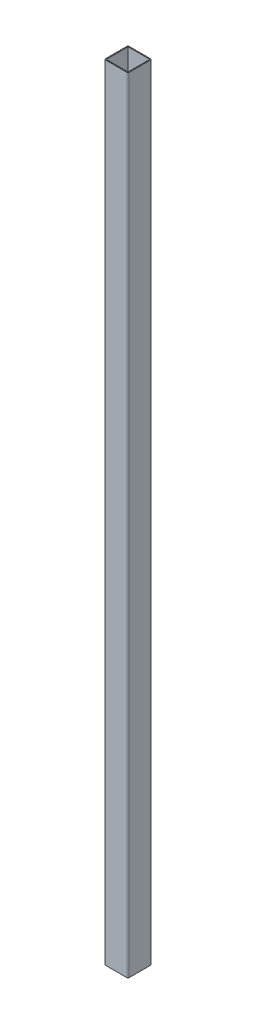
ISO-10303-21;
HEADER;
FILE_DESCRIPTION(('STEP AP214'),'2;1');
FILE_NAME('part.step','',(''),(''),'','','');
FILE_SCHEMA(('AUTOMOTIVE_DESIGN { 1 0 10303 214 1 1 1 1 }'));
ENDSEC;
DATA;
#1=APPLICATION_CONTEXT('core data for automotive mechanical design processes');
#2=APPLICATION_PROTOCOL_DEFINITION('international standard','automotive_design',2000,#1);
#3=PRODUCT_CONTEXT('',#1,'mechanical');
#4=PRODUCT('Part','Part','',(#3));
#5=PRODUCT_RELATED_PRODUCT_CATEGORY('part','',(#4));
#6=PRODUCT_DEFINITION_FORMATION('','',#4);
#7=PRODUCT_DEFINITION_CONTEXT('part definition',#1,'design');
#8=PRODUCT_DEFINITION('design','',#6,#7);
#9=PRODUCT_DEFINITION_SHAPE('','',#8);
#10=(LENGTH_UNIT() NAMED_UNIT(*) SI_UNIT(.MILLI.,.METRE.));
#11=(NAMED_UNIT(*) PLANE_ANGLE_UNIT() SI_UNIT($,.RADIAN.));
#12=(NAMED_UNIT(*) SI_UNIT($,.STERADIAN.) SOLID_ANGLE_UNIT());
#13=UNCERTAINTY_MEASURE_WITH_UNIT(LENGTH_MEASURE(1.E-05),#10,'distance_accuracy_value','');
#14=(GEOMETRIC_REPRESENTATION_CONTEXT(3) GLOBAL_UNCERTAINTY_ASSIGNED_CONTEXT((#13)) GLOBAL_UNIT_ASSIGNED_CONTEXT((#10,
#11,#12)) REPRESENTATION_CONTEXT('',''));
#15=CARTESIAN_POINT('',(0.,0.,0.));
#16=DIRECTION('',(0.,0.,1.));
#17=DIRECTION('',(1.,0.,0.));
#18=AXIS2_PLACEMENT_3D('',#15,#16,#17);
#19=CARTESIAN_POINT('',(73.9990000000007,-5307.,73.999));
#20=DIRECTION('',(0.,1.,0.));
#21=DIRECTION('',(-1.,0.,0.));
#22=AXIS2_PLACEMENT_3D('',#19,#20,#21);
#23=CYLINDRICAL_SURFACE('',#22,6.00100000000001);
#24=CARTESIAN_POINT('',(73.999,0.,73.999));
#25=DIRECTION('',(0.,-1.,0.));
#26=DIRECTION('',(1.,0.,0.));
#27=AXIS2_PLACEMENT_3D('',#24,#25,#26);
#28=CIRCLE('',#27,6.00100000000001);
#29=CARTESIAN_POINT('',(80.,0.,73.999));
#30=VERTEX_POINT('',#29);
#31=CARTESIAN_POINT('',(73.999,0.,80.));
#32=VERTEX_POINT('',#31);
#33=EDGE_CURVE('E232',#30,#32,#28,.T.);
#34=ORIENTED_EDGE('',*,*,#33,.T.);
#35=DIRECTION('',(0.,1.,0.));
#36=VECTOR('',#35,1.);
#37=CARTESIAN_POINT('',(73.9990000000007,-5307.,80.));
#38=LINE('',#37,#36);
#39=CARTESIAN_POINT('',(73.9990000000007,-5307.,80.));
#40=VERTEX_POINT('',#39);
#41=EDGE_CURVE('E12',#40,#32,#38,.T.);
#42=ORIENTED_EDGE('',*,*,#41,.F.);
#43=CARTESIAN_POINT('',(73.9990000000007,-5307.,73.999));
#44=DIRECTION('',(0.,-1.,0.));
#45=DIRECTION('',(1.,0.,0.));
#46=AXIS2_PLACEMENT_3D('',#43,#44,#45);
#47=CIRCLE('',#46,6.00100000000001);
#48=CARTESIAN_POINT('',(80.0000000000006,-5307.,73.999));
#49=VERTEX_POINT('',#48);
#50=EDGE_CURVE('E310',#49,#40,#47,.T.);
#51=ORIENTED_EDGE('',*,*,#50,.F.);
#52=DIRECTION('',(0.,1.,0.));
#53=VECTOR('',#52,1.);
#54=CARTESIAN_POINT('',(80.0000000000006,-5307.,73.999));
#55=LINE('',#54,#53);
#56=EDGE_CURVE('E247',#49,#30,#55,.T.);
#57=ORIENTED_EDGE('',*,*,#56,.T.);
#58=EDGE_LOOP('',(#34,#42,#51,#57));
#59=FACE_BOUND('',#58,.T.);
#60=ADVANCED_FACE('F60',(#59),#23,.T.);
#61=CARTESIAN_POINT('',(73.9990000000007,-5307.,80.));
#62=DIRECTION('',(0.,0.,-1.));
#63=DIRECTION('',(-1.,0.,0.));
#64=AXIS2_PLACEMENT_3D('',#61,#62,#63);
#65=PLANE('',#64);
#66=DIRECTION('',(-1.,0.,0.));
#67=VECTOR('',#66,1.);
#68=CARTESIAN_POINT('',(73.999,0.,80.));
#69=LINE('',#68,#67);
#70=CARTESIAN_POINT('',(-73.999,0.,80.));
#71=VERTEX_POINT('',#70);
#72=EDGE_CURVE('E235',#32,#71,#69,.T.);
#73=ORIENTED_EDGE('',*,*,#72,.T.);
#74=DIRECTION('',(0.,1.,0.));
#75=VECTOR('',#74,1.);
#76=CARTESIAN_POINT('',(-73.9989999999994,-5307.,80.));
#77=LINE('',#76,#75);
#78=CARTESIAN_POINT('',(-73.9989999999994,-5307.,80.));
#79=VERTEX_POINT('',#78);
#80=EDGE_CURVE('E70',#79,#71,#77,.T.);
#81=ORIENTED_EDGE('',*,*,#80,.F.);
#82=DIRECTION('',(-1.,0.,0.));
#83=VECTOR('',#82,1.);
#84=CARTESIAN_POINT('',(73.9990000000007,-5307.,80.));
#85=LINE('',#84,#83);
#86=EDGE_CURVE('E312',#40,#79,#85,.T.);
#87=ORIENTED_EDGE('',*,*,#86,.F.);
#88=ORIENTED_EDGE('',*,*,#41,.T.);
#89=EDGE_LOOP('',(#73,#81,#87,#88));
#90=FACE_BOUND('',#89,.T.);
#91=ADVANCED_FACE('F347',(#90),#65,.F.);
#92=CARTESIAN_POINT('',(-73.9989999999994,-5307.,73.999));
#93=DIRECTION('',(0.,1.,0.));
#94=DIRECTION('',(-1.,0.,0.));
#95=AXIS2_PLACEMENT_3D('',#92,#93,#94);
#96=CYLINDRICAL_SURFACE('',#95,6.00100000000001);
#97=CARTESIAN_POINT('',(-73.999,0.,73.999));
#98=DIRECTION('',(0.,-1.,0.));
#99=DIRECTION('',(1.,0.,0.));
#100=AXIS2_PLACEMENT_3D('',#97,#98,#99);
#101=CIRCLE('',#100,6.00100000000001);
#102=CARTESIAN_POINT('',(-80.,0.,73.999));
#103=VERTEX_POINT('',#102);
#104=EDGE_CURVE('E237',#71,#103,#101,.T.);
#105=ORIENTED_EDGE('',*,*,#104,.T.);
#106=DIRECTION('',(0.,1.,0.));
#107=VECTOR('',#106,1.);
#108=CARTESIAN_POINT('',(-79.9999999999993,-5307.,73.999));
#109=LINE('',#108,#107);
#110=CARTESIAN_POINT('',(-79.9999999999993,-5307.,73.999));
#111=VERTEX_POINT('',#110);
#112=EDGE_CURVE('E254',#111,#103,#109,.T.);
#113=ORIENTED_EDGE('',*,*,#112,.F.);
#114=CARTESIAN_POINT('',(-73.9989999999994,-5307.,73.999));
#115=DIRECTION('',(0.,-1.,0.));
#116=DIRECTION('',(1.,0.,0.));
#117=AXIS2_PLACEMENT_3D('',#114,#115,#116);
#118=CIRCLE('',#117,6.00100000000001);
#119=EDGE_CURVE('E314',#79,#111,#118,.T.);
#120=ORIENTED_EDGE('',*,*,#119,.F.);
#121=ORIENTED_EDGE('',*,*,#80,.T.);
#122=EDGE_LOOP('',(#105,#113,#120,#121));
#123=FACE_BOUND('',#122,.T.);
#124=ADVANCED_FACE('F352',(#123),#96,.T.);
#125=CARTESIAN_POINT('',(-79.9999999999993,-5307.,-73.999));
#126=DIRECTION('',(1.,0.,0.));
#127=DIRECTION('',(0.,1.,0.));
#128=AXIS2_PLACEMENT_3D('',#125,#126,#127);
#129=PLANE('',#128);
#130=DIRECTION('',(0.,0.,-1.));
#131=VECTOR('',#130,1.);
#132=CARTESIAN_POINT('',(-80.,0.,-73.999));
#133=LINE('',#132,#131);
#134=CARTESIAN_POINT('',(-80.,0.,-73.999));
#135=VERTEX_POINT('',#134);
#136=EDGE_CURVE('E239',#103,#135,#133,.T.);
#137=ORIENTED_EDGE('',*,*,#136,.T.);
#138=DIRECTION('',(0.,1.,0.));
#139=VECTOR('',#138,1.);
#140=CARTESIAN_POINT('',(-79.9999999999993,-5307.,-73.999));
#141=LINE('',#140,#139);
#142=CARTESIAN_POINT('',(-79.9999999999993,-5307.,-73.999));
#143=VERTEX_POINT('',#142);
#144=EDGE_CURVE('E251',#143,#135,#141,.T.);
#145=ORIENTED_EDGE('',*,*,#144,.F.);
#146=DIRECTION('',(0.,0.,-1.));
#147=VECTOR('',#146,1.);
#148=CARTESIAN_POINT('',(-79.9999999999993,-5307.,-73.999));
#149=LINE('',#148,#147);
#150=EDGE_CURVE('E316',#111,#143,#149,.T.);
#151=ORIENTED_EDGE('',*,*,#150,.F.);
#152=ORIENTED_EDGE('',*,*,#112,.T.);
#153=EDGE_LOOP('',(#137,#145,#151,#152));
#154=FACE_BOUND('',#153,.T.);
#155=ADVANCED_FACE('F322',(#154),#129,.F.);
#156=CARTESIAN_POINT('',(-73.9989999999993,-5307.,-73.999));
#157=DIRECTION('',(0.,1.,0.));
#158=DIRECTION('',(-1.,0.,0.));
#159=AXIS2_PLACEMENT_3D('',#156,#157,#158);
#160=CYLINDRICAL_SURFACE('',#159,6.001);
#161=CARTESIAN_POINT('',(-73.999,0.,-73.999));
#162=DIRECTION('',(0.,-1.,0.));
#163=DIRECTION('',(1.,0.,0.));
#164=AXIS2_PLACEMENT_3D('',#161,#162,#163);
#165=CIRCLE('',#164,6.001);
#166=CARTESIAN_POINT('',(-73.999,0.,-80.));
#167=VERTEX_POINT('',#166);
#168=EDGE_CURVE('E241',#135,#167,#165,.T.);
#169=ORIENTED_EDGE('',*,*,#168,.T.);
#170=DIRECTION('',(0.,1.,0.));
#171=VECTOR('',#170,1.);
#172=CARTESIAN_POINT('',(-73.9989999999994,-5307.,-80.));
#173=LINE('',#172,#171);
#174=CARTESIAN_POINT('',(-73.9989999999994,-5307.,-80.));
#175=VERTEX_POINT('',#174);
#176=EDGE_CURVE('E199',#175,#167,#173,.T.);
#177=ORIENTED_EDGE('',*,*,#176,.F.);
#178=CARTESIAN_POINT('',(-73.9989999999993,-5307.,-73.999));
#179=DIRECTION('',(0.,-1.,0.));
#180=DIRECTION('',(1.,0.,0.));
#181=AXIS2_PLACEMENT_3D('',#178,#179,#180);
#182=CIRCLE('',#181,6.001);
#183=EDGE_CURVE('E190',#143,#175,#182,.T.);
#184=ORIENTED_EDGE('',*,*,#183,.F.);
#185=ORIENTED_EDGE('',*,*,#144,.T.);
#186=EDGE_LOOP('',(#169,#177,#184,#185));
#187=FACE_BOUND('',#186,.T.);
#188=ADVANCED_FACE('F326',(#187),#160,.T.);
#189=CARTESIAN_POINT('',(-73.9989999999994,-5307.,-80.));
#190=DIRECTION('',(0.,0.,1.));
#191=DIRECTION('',(1.,0.,0.));
#192=AXIS2_PLACEMENT_3D('',#189,#190,#191);
#193=PLANE('',#192);
#194=DIRECTION('',(1.,0.,0.));
#195=VECTOR('',#194,1.);
#196=CARTESIAN_POINT('',(-73.999,0.,-80.));
#197=LINE('',#196,#195);
#198=CARTESIAN_POINT('',(73.999,0.,-80.));
#199=VERTEX_POINT('',#198);
#200=EDGE_CURVE('E198',#167,#199,#197,.T.);
#201=ORIENTED_EDGE('',*,*,#200,.T.);
#202=DIRECTION('',(0.,1.,0.));
#203=VECTOR('',#202,1.);
#204=CARTESIAN_POINT('',(73.9990000000007,-5307.,-80.));
#205=LINE('',#204,#203);
#206=CARTESIAN_POINT('',(73.9990000000007,-5307.,-80.));
#207=VERTEX_POINT('',#206);
#208=EDGE_CURVE('E195',#207,#199,#205,.T.);
#209=ORIENTED_EDGE('',*,*,#208,.F.);
#210=DIRECTION('',(1.,0.,0.));
#211=VECTOR('',#210,1.);
#212=CARTESIAN_POINT('',(-73.9989999999994,-5307.,-80.));
#213=LINE('',#212,#211);
#214=EDGE_CURVE('E184',#175,#207,#213,.T.);
#215=ORIENTED_EDGE('',*,*,#214,.F.);
#216=ORIENTED_EDGE('',*,*,#176,.T.);
#217=EDGE_LOOP('',(#201,#209,#215,#216));
#218=FACE_BOUND('',#217,.T.);
#219=ADVANCED_FACE('F196',(#218),#193,.F.);
#220=CARTESIAN_POINT('',(73.9990000000006,-5307.,-73.999));
#221=DIRECTION('',(0.,1.,0.));
#222=DIRECTION('',(-1.,0.,0.));
#223=AXIS2_PLACEMENT_3D('',#220,#221,#222);
#224=CYLINDRICAL_SURFACE('',#223,6.001);
#225=CARTESIAN_POINT('',(73.999,0.,-73.999));
#226=DIRECTION('',(0.,-1.,0.));
#227=DIRECTION('',(1.,0.,0.));
#228=AXIS2_PLACEMENT_3D('',#225,#226,#227);
#229=CIRCLE('',#228,6.001);
#230=CARTESIAN_POINT('',(80.,0.,-73.999));
#231=VERTEX_POINT('',#230);
#232=EDGE_CURVE('E132',#199,#231,#229,.T.);
#233=ORIENTED_EDGE('',*,*,#232,.T.);
#234=DIRECTION('',(0.,1.,0.));
#235=VECTOR('',#234,1.);
#236=CARTESIAN_POINT('',(80.0000000000006,-5307.,-73.999));
#237=LINE('',#236,#235);
#238=CARTESIAN_POINT('',(80.0000000000006,-5307.,-73.999));
#239=VERTEX_POINT('',#238);
#240=EDGE_CURVE('E200',#239,#231,#237,.T.);
#241=ORIENTED_EDGE('',*,*,#240,.F.);
#242=CARTESIAN_POINT('',(73.9990000000006,-5307.,-73.999));
#243=DIRECTION('',(0.,-1.,0.));
#244=DIRECTION('',(1.,0.,0.));
#245=AXIS2_PLACEMENT_3D('',#242,#243,#244);
#246=CIRCLE('',#245,6.001);
#247=EDGE_CURVE('E188',#207,#239,#246,.T.);
#248=ORIENTED_EDGE('',*,*,#247,.F.);
#249=ORIENTED_EDGE('',*,*,#208,.T.);
#250=EDGE_LOOP('',(#233,#241,#248,#249));
#251=FACE_BOUND('',#250,.T.);
#252=ADVANCED_FACE('F202',(#251),#224,.T.);
#253=CARTESIAN_POINT('',(-73.9989999999994,-5307.,73.999));
#254=DIRECTION('',(0.,1.,0.));
#255=DIRECTION('',(-1.,0.,0.));
#256=AXIS2_PLACEMENT_3D('',#253,#254,#255);
#257=CYLINDRICAL_SURFACE('',#256,0.000999999999987122);
#258=CARTESIAN_POINT('',(-73.999,0.,73.999));
#259=DIRECTION('',(0.,-1.,0.));
#260=DIRECTION('',(1.,0.,0.));
#261=AXIS2_PLACEMENT_3D('',#258,#259,#260);
#262=CIRCLE('',#261,0.000999999999987122);
#263=CARTESIAN_POINT('',(-73.999,0.,74.));
#264=VERTEX_POINT('',#263);
#265=CARTESIAN_POINT('',(-74.,0.,73.999));
#266=VERTEX_POINT('',#265);
#267=EDGE_CURVE('E208',#264,#266,#262,.T.);
#268=ORIENTED_EDGE('',*,*,#267,.F.);
#269=DIRECTION('',(0.,1.,0.));
#270=VECTOR('',#269,1.);
#271=CARTESIAN_POINT('',(-73.9989999999993,-5307.,74.));
#272=LINE('',#271,#270);
#273=CARTESIAN_POINT('',(-73.9989999999993,-5307.,74.));
#274=VERTEX_POINT('',#273);
#275=EDGE_CURVE('E64',#274,#264,#272,.T.);
#276=ORIENTED_EDGE('',*,*,#275,.F.);
#277=CARTESIAN_POINT('',(-73.9989999999994,-5307.,73.999));
#278=DIRECTION('',(0.,-1.,0.));
#279=DIRECTION('',(1.,0.,0.));
#280=AXIS2_PLACEMENT_3D('',#277,#278,#279);
#281=CIRCLE('',#280,0.000999999999987122);
#282=CARTESIAN_POINT('',(-73.9999999999993,-5307.,73.999));
#283=VERTEX_POINT('',#282);
#284=EDGE_CURVE('E246',#274,#283,#281,.T.);
#285=ORIENTED_EDGE('',*,*,#284,.T.);
#286=DIRECTION('',(0.,1.,0.));
#287=VECTOR('',#286,1.);
#288=CARTESIAN_POINT('',(-73.9999999999993,-5307.,73.999));
#289=LINE('',#288,#287);
#290=EDGE_CURVE('E204',#283,#266,#289,.T.);
#291=ORIENTED_EDGE('',*,*,#290,.T.);
#292=EDGE_LOOP('',(#268,#276,#285,#291));
#293=FACE_BOUND('',#292,.T.);
#294=ADVANCED_FACE('F62',(#293),#257,.F.);
#295=CARTESIAN_POINT('',(73.9990000000006,-5307.,74.));
#296=DIRECTION('',(0.,0.,-1.));
#297=DIRECTION('',(-1.,0.,0.));
#298=AXIS2_PLACEMENT_3D('',#295,#296,#297);
#299=PLANE('',#298);
#300=DIRECTION('',(-1.,0.,0.));
#301=VECTOR('',#300,1.);
#302=CARTESIAN_POINT('',(73.999,0.,74.));
#303=LINE('',#302,#301);
#304=CARTESIAN_POINT('',(73.999,0.,74.));
#305=VERTEX_POINT('',#304);
#306=EDGE_CURVE('E211',#305,#264,#303,.T.);
#307=ORIENTED_EDGE('',*,*,#306,.F.);
#308=DIRECTION('',(0.,1.,0.));
#309=VECTOR('',#308,1.);
#310=CARTESIAN_POINT('',(73.9990000000006,-5307.,74.));
#311=LINE('',#310,#309);
#312=CARTESIAN_POINT('',(73.9990000000006,-5307.,74.));
#313=VERTEX_POINT('',#312);
#314=EDGE_CURVE('E269',#313,#305,#311,.T.);
#315=ORIENTED_EDGE('',*,*,#314,.F.);
#316=DIRECTION('',(-1.,0.,0.));
#317=VECTOR('',#316,1.);
#318=CARTESIAN_POINT('',(73.9990000000006,-5307.,74.));
#319=LINE('',#318,#317);
#320=EDGE_CURVE('E278',#313,#274,#319,.T.);
#321=ORIENTED_EDGE('',*,*,#320,.T.);
#322=ORIENTED_EDGE('',*,*,#275,.T.);
#323=EDGE_LOOP('',(#307,#315,#321,#322));
#324=FACE_BOUND('',#323,.T.);
#325=ADVANCED_FACE('F276',(#324),#299,.T.);
#326=CARTESIAN_POINT('',(73.9990000000007,-5307.,73.999));
#327=DIRECTION('',(0.,1.,0.));
#328=DIRECTION('',(-1.,0.,0.));
#329=AXIS2_PLACEMENT_3D('',#326,#327,#328);
#330=CYLINDRICAL_SURFACE('',#329,0.000999999999987122);
#331=CARTESIAN_POINT('',(73.999,0.,73.999));
#332=DIRECTION('',(0.,-1.,0.));
#333=DIRECTION('',(1.,0.,0.));
#334=AXIS2_PLACEMENT_3D('',#331,#332,#333);
#335=CIRCLE('',#334,0.000999999999987122);
#336=CARTESIAN_POINT('',(74.,0.,73.999));
#337=VERTEX_POINT('',#336);
#338=EDGE_CURVE('E214',#337,#305,#335,.T.);
#339=ORIENTED_EDGE('',*,*,#338,.F.);
#340=DIRECTION('',(0.,1.,0.));
#341=VECTOR('',#340,1.);
#342=CARTESIAN_POINT('',(74.0000000000007,-5307.,73.999));
#343=LINE('',#342,#341);
#344=CARTESIAN_POINT('',(74.0000000000007,-5307.,73.999));
#345=VERTEX_POINT('',#344);
#346=EDGE_CURVE('E268',#345,#337,#343,.T.);
#347=ORIENTED_EDGE('',*,*,#346,.F.);
#348=CARTESIAN_POINT('',(73.9990000000007,-5307.,73.999));
#349=DIRECTION('',(0.,-1.,0.));
#350=DIRECTION('',(1.,0.,0.));
#351=AXIS2_PLACEMENT_3D('',#348,#349,#350);
#352=CIRCLE('',#351,0.000999999999987122);
#353=EDGE_CURVE('E286',#345,#313,#352,.T.);
#354=ORIENTED_EDGE('',*,*,#353,.T.);
#355=ORIENTED_EDGE('',*,*,#314,.T.);
#356=EDGE_LOOP('',(#339,#347,#354,#355));
#357=FACE_BOUND('',#356,.T.);
#358=ADVANCED_FACE('F284',(#357),#330,.F.);
#359=CARTESIAN_POINT('',(74.0000000000006,-5307.,73.999));
#360=DIRECTION('',(-1.,0.,0.));
#361=DIRECTION('',(0.,-1.,0.));
#362=AXIS2_PLACEMENT_3D('',#359,#360,#361);
#363=PLANE('',#362);
#364=DIRECTION('',(0.,0.,1.));
#365=VECTOR('',#364,1.);
#366=CARTESIAN_POINT('',(74.,0.,73.999));
#367=LINE('',#366,#365);
#368=CARTESIAN_POINT('',(74.,0.,-73.999));
#369=VERTEX_POINT('',#368);
#370=EDGE_CURVE('E217',#369,#337,#367,.T.);
#371=ORIENTED_EDGE('',*,*,#370,.F.);
#372=DIRECTION('',(0.,1.,0.));
#373=VECTOR('',#372,1.);
#374=CARTESIAN_POINT('',(74.0000000000006,-5307.,-73.999));
#375=LINE('',#374,#373);
#376=CARTESIAN_POINT('',(74.0000000000006,-5307.,-73.999));
#377=VERTEX_POINT('',#376);
#378=EDGE_CURVE('E266',#377,#369,#375,.T.);
#379=ORIENTED_EDGE('',*,*,#378,.F.);
#380=DIRECTION('',(0.,0.,1.));
#381=VECTOR('',#380,1.);
#382=CARTESIAN_POINT('',(74.0000000000006,-5307.,73.999));
#383=LINE('',#382,#381);
#384=EDGE_CURVE('E292',#377,#345,#383,.T.);
#385=ORIENTED_EDGE('',*,*,#384,.T.);
#386=ORIENTED_EDGE('',*,*,#346,.T.);
#387=EDGE_LOOP('',(#371,#379,#385,#386));
#388=FACE_BOUND('',#387,.T.);
#389=ADVANCED_FACE('F295',(#388),#363,.T.);
#390=CARTESIAN_POINT('',(73.9990000000006,-5307.,-73.999));
#391=DIRECTION('',(0.,1.,0.));
#392=DIRECTION('',(-1.,0.,0.));
#393=AXIS2_PLACEMENT_3D('',#390,#391,#392);
#394=CYLINDRICAL_SURFACE('',#393,0.000999999999980183);
#395=CARTESIAN_POINT('',(73.999,0.,-73.999));
#396=DIRECTION('',(0.,-1.,0.));
#397=DIRECTION('',(1.,0.,0.));
#398=AXIS2_PLACEMENT_3D('',#395,#396,#397);
#399=CIRCLE('',#398,0.000999999999980183);
#400=CARTESIAN_POINT('',(73.999,0.,-74.));
#401=VERTEX_POINT('',#400);
#402=EDGE_CURVE('E220',#401,#369,#399,.T.);
#403=ORIENTED_EDGE('',*,*,#402,.F.);
#404=DIRECTION('',(0.,1.,0.));
#405=VECTOR('',#404,1.);
#406=CARTESIAN_POINT('',(73.9990000000006,-5307.,-74.));
#407=LINE('',#406,#405);
#408=CARTESIAN_POINT('',(73.9990000000006,-5307.,-74.));
#409=VERTEX_POINT('',#408);
#410=EDGE_CURVE('E264',#409,#401,#407,.T.);
#411=ORIENTED_EDGE('',*,*,#410,.F.);
#412=CARTESIAN_POINT('',(73.9990000000006,-5307.,-73.999));
#413=DIRECTION('',(0.,-1.,0.));
#414=DIRECTION('',(1.,0.,0.));
#415=AXIS2_PLACEMENT_3D('',#412,#413,#414);
#416=CIRCLE('',#415,0.000999999999980183);
#417=EDGE_CURVE('E296',#409,#377,#416,.T.);
#418=ORIENTED_EDGE('',*,*,#417,.T.);
#419=ORIENTED_EDGE('',*,*,#378,.T.);
#420=EDGE_LOOP('',(#403,#411,#418,#419));
#421=FACE_BOUND('',#420,.T.);
#422=ADVANCED_FACE('F363',(#421),#394,.F.);
#423=CARTESIAN_POINT('',(-73.9989999999993,-5307.,-74.));
#424=DIRECTION('',(0.,0.,1.));
#425=DIRECTION('',(1.,0.,0.));
#426=AXIS2_PLACEMENT_3D('',#423,#424,#425);
#427=PLANE('',#426);
#428=DIRECTION('',(1.,0.,0.));
#429=VECTOR('',#428,1.);
#430=CARTESIAN_POINT('',(-73.999,0.,-74.));
#431=LINE('',#430,#429);
#432=CARTESIAN_POINT('',(-73.999,0.,-74.));
#433=VERTEX_POINT('',#432);
#434=EDGE_CURVE('E223',#433,#401,#431,.T.);
#435=ORIENTED_EDGE('',*,*,#434,.F.);
#436=DIRECTION('',(0.,1.,0.));
#437=VECTOR('',#436,1.);
#438=CARTESIAN_POINT('',(-73.9989999999993,-5307.,-74.));
#439=LINE('',#438,#437);
#440=CARTESIAN_POINT('',(-73.9989999999993,-5307.,-74.));
#441=VERTEX_POINT('',#440);
#442=EDGE_CURVE('E262',#441,#433,#439,.T.);
#443=ORIENTED_EDGE('',*,*,#442,.F.);
#444=DIRECTION('',(1.,0.,0.));
#445=VECTOR('',#444,1.);
#446=CARTESIAN_POINT('',(-73.9989999999993,-5307.,-74.));
#447=LINE('',#446,#445);
#448=EDGE_CURVE('E298',#441,#409,#447,.T.);
#449=ORIENTED_EDGE('',*,*,#448,.T.);
#450=ORIENTED_EDGE('',*,*,#410,.T.);
#451=EDGE_LOOP('',(#435,#443,#449,#450));
#452=FACE_BOUND('',#451,.T.);
#453=ADVANCED_FACE('F359',(#452),#427,.T.);
#454=CARTESIAN_POINT('',(-73.9989999999993,-5307.,-73.999));
#455=DIRECTION('',(0.,1.,0.));
#456=DIRECTION('',(-1.,0.,0.));
#457=AXIS2_PLACEMENT_3D('',#454,#455,#456);
#458=CYLINDRICAL_SURFACE('',#457,0.000999999999980183);
#459=CARTESIAN_POINT('',(-73.999,0.,-73.999));
#460=DIRECTION('',(0.,-1.,0.));
#461=DIRECTION('',(1.,0.,0.));
#462=AXIS2_PLACEMENT_3D('',#459,#460,#461);
#463=CIRCLE('',#462,0.000999999999980183);
#464=CARTESIAN_POINT('',(-74.,0.,-73.999));
#465=VERTEX_POINT('',#464);
#466=EDGE_CURVE('E226',#465,#433,#463,.T.);
#467=ORIENTED_EDGE('',*,*,#466,.F.);
#468=DIRECTION('',(0.,1.,0.));
#469=VECTOR('',#468,1.);
#470=CARTESIAN_POINT('',(-73.9999999999993,-5307.,-73.999));
#471=LINE('',#470,#469);
#472=CARTESIAN_POINT('',(-73.9999999999993,-5307.,-73.999));
#473=VERTEX_POINT('',#472);
#474=EDGE_CURVE('E260',#473,#465,#471,.T.);
#475=ORIENTED_EDGE('',*,*,#474,.F.);
#476=CARTESIAN_POINT('',(-73.9989999999993,-5307.,-73.999));
#477=DIRECTION('',(0.,-1.,0.));
#478=DIRECTION('',(1.,0.,0.));
#479=AXIS2_PLACEMENT_3D('',#476,#477,#478);
#480=CIRCLE('',#479,0.000999999999980183);
#481=EDGE_CURVE('E304',#473,#441,#480,.T.);
#482=ORIENTED_EDGE('',*,*,#481,.T.);
#483=ORIENTED_EDGE('',*,*,#442,.T.);
#484=EDGE_LOOP('',(#467,#475,#482,#483));
#485=FACE_BOUND('',#484,.T.);
#486=ADVANCED_FACE('F341',(#485),#458,.F.);
#487=CARTESIAN_POINT('',(-73.9999999999993,-5307.,-73.999));
#488=DIRECTION('',(1.,0.,0.));
#489=DIRECTION('',(0.,1.,0.));
#490=AXIS2_PLACEMENT_3D('',#487,#488,#489);
#491=PLANE('',#490);
#492=DIRECTION('',(0.,0.,-1.));
#493=VECTOR('',#492,1.);
#494=CARTESIAN_POINT('',(-74.,0.,-73.999));
#495=LINE('',#494,#493);
#496=EDGE_CURVE('E229',#266,#465,#495,.T.);
#497=ORIENTED_EDGE('',*,*,#496,.F.);
#498=ORIENTED_EDGE('',*,*,#290,.F.);
#499=DIRECTION('',(0.,0.,-1.));
#500=VECTOR('',#499,1.);
#501=CARTESIAN_POINT('',(-73.9999999999993,-5307.,-73.999));
#502=LINE('',#501,#500);
#503=EDGE_CURVE('E307',#283,#473,#502,.T.);
#504=ORIENTED_EDGE('',*,*,#503,.T.);
#505=ORIENTED_EDGE('',*,*,#474,.T.);
#506=EDGE_LOOP('',(#497,#498,#504,#505));
#507=FACE_BOUND('',#506,.T.);
#508=ADVANCED_FACE('F334',(#507),#491,.T.);
#509=CARTESIAN_POINT('',(80.0000000000006,-5307.,73.999));
#510=DIRECTION('',(-1.,0.,0.));
#511=DIRECTION('',(0.,-1.,0.));
#512=AXIS2_PLACEMENT_3D('',#509,#510,#511);
#513=PLANE('',#512);
#514=DIRECTION('',(0.,0.,1.));
#515=VECTOR('',#514,1.);
#516=CARTESIAN_POINT('',(80.,0.,73.999));
#517=LINE('',#516,#515);
#518=EDGE_CURVE('E138',#231,#30,#517,.T.);
#519=ORIENTED_EDGE('',*,*,#518,.T.);
#520=ORIENTED_EDGE('',*,*,#56,.F.);
#521=DIRECTION('',(0.,0.,1.));
#522=VECTOR('',#521,1.);
#523=CARTESIAN_POINT('',(80.0000000000006,-5307.,73.999));
#524=LINE('',#523,#522);
#525=EDGE_CURVE('E79',#239,#49,#524,.T.);
#526=ORIENTED_EDGE('',*,*,#525,.F.);
#527=ORIENTED_EDGE('',*,*,#240,.T.);
#528=EDGE_LOOP('',(#519,#520,#526,#527));
#529=FACE_BOUND('',#528,.T.);
#530=ADVANCED_FACE('F332',(#529),#513,.F.);
#531=CARTESIAN_POINT('',(73.9990000000007,-5307.,73.999));
#532=DIRECTION('',(0.,-1.,0.));
#533=DIRECTION('',(1.,0.,0.));
#534=AXIS2_PLACEMENT_3D('',#531,#532,#533);
#535=PLANE('',#534);
#536=ORIENTED_EDGE('',*,*,#284,.F.);
#537=ORIENTED_EDGE('',*,*,#320,.F.);
#538=ORIENTED_EDGE('',*,*,#353,.F.);
#539=ORIENTED_EDGE('',*,*,#384,.F.);
#540=ORIENTED_EDGE('',*,*,#417,.F.);
#541=ORIENTED_EDGE('',*,*,#448,.F.);
#542=ORIENTED_EDGE('',*,*,#481,.F.);
#543=ORIENTED_EDGE('',*,*,#503,.F.);
#544=EDGE_LOOP('',(#536,#537,#538,#539,#540,#541,#542,#543));
#545=FACE_BOUND('',#544,.T.);
#546=ORIENTED_EDGE('',*,*,#50,.T.);
#547=ORIENTED_EDGE('',*,*,#86,.T.);
#548=ORIENTED_EDGE('',*,*,#119,.T.);
#549=ORIENTED_EDGE('',*,*,#150,.T.);
#550=ORIENTED_EDGE('',*,*,#183,.T.);
#551=ORIENTED_EDGE('',*,*,#214,.T.);
#552=ORIENTED_EDGE('',*,*,#247,.T.);
#553=ORIENTED_EDGE('',*,*,#525,.T.);
#554=EDGE_LOOP('',(#546,#547,#548,#549,#550,#551,#552,#553));
#555=FACE_BOUND('',#554,.T.);
#556=ADVANCED_FACE('F186',(#545,#555),#535,.T.);
#557=CARTESIAN_POINT('',(73.999,0.,73.999));
#558=DIRECTION('',(0.,-1.,0.));
#559=DIRECTION('',(1.,0.,0.));
#560=AXIS2_PLACEMENT_3D('',#557,#558,#559);
#561=PLANE('',#560);
#562=ORIENTED_EDGE('',*,*,#267,.T.);
#563=ORIENTED_EDGE('',*,*,#496,.T.);
#564=ORIENTED_EDGE('',*,*,#466,.T.);
#565=ORIENTED_EDGE('',*,*,#434,.T.);
#566=ORIENTED_EDGE('',*,*,#402,.T.);
#567=ORIENTED_EDGE('',*,*,#370,.T.);
#568=ORIENTED_EDGE('',*,*,#338,.T.);
#569=ORIENTED_EDGE('',*,*,#306,.T.);
#570=EDGE_LOOP('',(#562,#563,#564,#565,#566,#567,#568,#569));
#571=FACE_BOUND('',#570,.T.);
#572=ORIENTED_EDGE('',*,*,#33,.F.);
#573=ORIENTED_EDGE('',*,*,#518,.F.);
#574=ORIENTED_EDGE('',*,*,#232,.F.);
#575=ORIENTED_EDGE('',*,*,#200,.F.);
#576=ORIENTED_EDGE('',*,*,#168,.F.);
#577=ORIENTED_EDGE('',*,*,#136,.F.);
#578=ORIENTED_EDGE('',*,*,#104,.F.);
#579=ORIENTED_EDGE('',*,*,#72,.F.);
#580=EDGE_LOOP('',(#572,#573,#574,#575,#576,#577,#578,#579));
#581=FACE_BOUND('',#580,.T.);
#582=ADVANCED_FACE('F281',(#571,#581),#561,.F.);
#583=CLOSED_SHELL('',(#60,#91,#124,#155,#188,#219,#252,#294,#325,#358,#389,#422,#453,#486,#508,
#530,#556,#582));
#584=MANIFOLD_SOLID_BREP('B2',#583);
#585=ADVANCED_BREP_SHAPE_REPRESENTATION('',(#18,#584),#14);
#586=SHAPE_DEFINITION_REPRESENTATION(#9,#585);
ENDSEC;
END-ISO-10303-21;
